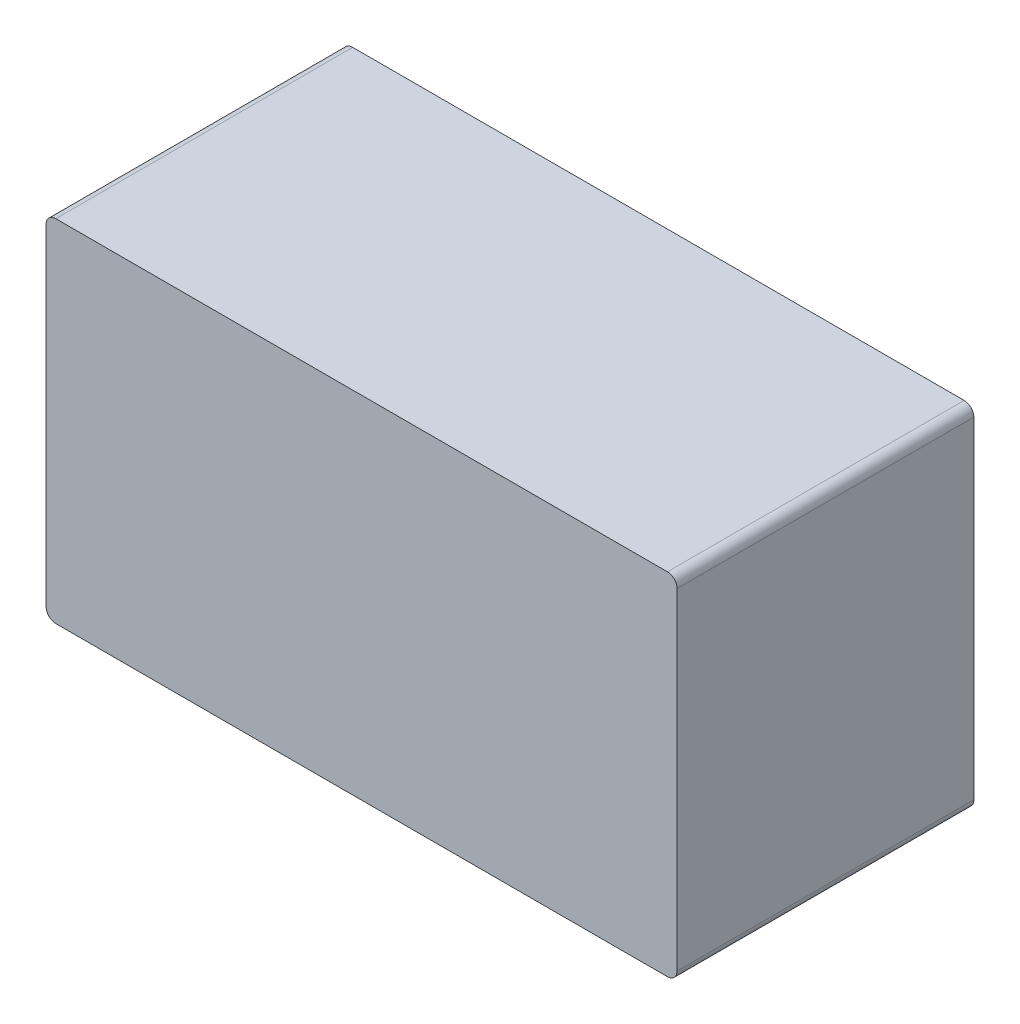
ISO-10303-21;
HEADER;
FILE_DESCRIPTION(('STEP AP214'),'2;1');
FILE_NAME('part.step','',(''),(''),'','','');
FILE_SCHEMA(('AUTOMOTIVE_DESIGN { 1 0 10303 214 1 1 1 1 }'));
ENDSEC;
DATA;
#1=APPLICATION_CONTEXT('core data for automotive mechanical design processes');
#2=APPLICATION_PROTOCOL_DEFINITION('international standard','automotive_design',2000,#1);
#3=PRODUCT_CONTEXT('',#1,'mechanical');
#4=PRODUCT('Part','Part','',(#3));
#5=PRODUCT_RELATED_PRODUCT_CATEGORY('part','',(#4));
#6=PRODUCT_DEFINITION_FORMATION('','',#4);
#7=PRODUCT_DEFINITION_CONTEXT('part definition',#1,'design');
#8=PRODUCT_DEFINITION('design','',#6,#7);
#9=PRODUCT_DEFINITION_SHAPE('','',#8);
#10=(LENGTH_UNIT() NAMED_UNIT(*) SI_UNIT(.MILLI.,.METRE.));
#11=(NAMED_UNIT(*) PLANE_ANGLE_UNIT() SI_UNIT($,.RADIAN.));
#12=(NAMED_UNIT(*) SI_UNIT($,.STERADIAN.) SOLID_ANGLE_UNIT());
#13=UNCERTAINTY_MEASURE_WITH_UNIT(LENGTH_MEASURE(1.E-05),#10,'distance_accuracy_value','');
#14=(GEOMETRIC_REPRESENTATION_CONTEXT(3) GLOBAL_UNCERTAINTY_ASSIGNED_CONTEXT((#13)) GLOBAL_UNIT_ASSIGNED_CONTEXT((#10,
#11,#12)) REPRESENTATION_CONTEXT('',''));
#15=CARTESIAN_POINT('',(0.,0.,0.));
#16=DIRECTION('',(0.,0.,1.));
#17=DIRECTION('',(1.,0.,0.));
#18=AXIS2_PLACEMENT_3D('',#15,#16,#17);
#19=CARTESIAN_POINT('',(38.5,-2.75,-2.5));
#20=DIRECTION('',(0.,0.,1.));
#21=DIRECTION('',(1.,0.,0.));
#22=AXIS2_PLACEMENT_3D('',#19,#20,#21);
#23=PLANE('',#22);
#24=CARTESIAN_POINT('',(38.5,-2.75,-2.5));
#25=DIRECTION('',(0.,0.,1.));
#26=DIRECTION('',(1.,0.,0.));
#27=AXIS2_PLACEMENT_3D('',#24,#25,#26);
#28=CIRCLE('',#27,0.5);
#29=CARTESIAN_POINT('',(39.,-2.75,-2.5));
#30=VERTEX_POINT('',#29);
#31=EDGE_CURVE('E24',#30,#30,#28,.T.);
#32=ORIENTED_EDGE('',*,*,#31,.F.);
#33=EDGE_LOOP('',(#32));
#34=FACE_BOUND('',#33,.T.);
#35=ADVANCED_FACE('F15',(#34),#23,.F.);
#36=CARTESIAN_POINT('',(0.,0.,-2.5));
#37=DIRECTION('',(0.,0.,1.));
#38=DIRECTION('',(1.,0.,0.));
#39=AXIS2_PLACEMENT_3D('',#36,#37,#38);
#40=PLANE('',#39);
#41=CARTESIAN_POINT('',(0.,0.,-2.5));
#42=DIRECTION('',(0.,0.,1.));
#43=DIRECTION('',(1.,0.,0.));
#44=AXIS2_PLACEMENT_3D('',#41,#42,#43);
#45=CIRCLE('',#44,0.5);
#46=CARTESIAN_POINT('',(0.5,0.,-2.5));
#47=VERTEX_POINT('',#46);
#48=EDGE_CURVE('E211',#47,#47,#45,.T.);
#49=ORIENTED_EDGE('',*,*,#48,.F.);
#50=EDGE_LOOP('',(#49));
#51=FACE_BOUND('',#50,.T.);
#52=ADVANCED_FACE('F17',(#51),#40,.F.);
#53=CARTESIAN_POINT('',(38.5,-10.75,-2.5));
#54=DIRECTION('',(0.,0.,1.));
#55=DIRECTION('',(1.,0.,0.));
#56=AXIS2_PLACEMENT_3D('',#53,#54,#55);
#57=PLANE('',#56);
#58=CARTESIAN_POINT('',(38.5,-10.75,-2.5));
#59=DIRECTION('',(0.,0.,1.));
#60=DIRECTION('',(1.,0.,0.));
#61=AXIS2_PLACEMENT_3D('',#58,#59,#60);
#62=CIRCLE('',#61,0.5);
#63=CARTESIAN_POINT('',(39.,-10.75,-2.5));
#64=VERTEX_POINT('',#63);
#65=EDGE_CURVE('E208',#64,#64,#62,.T.);
#66=ORIENTED_EDGE('',*,*,#65,.F.);
#67=EDGE_LOOP('',(#66));
#68=FACE_BOUND('',#67,.T.);
#69=ADVANCED_FACE('F230',(#68),#57,.F.);
#70=CARTESIAN_POINT('',(0.,-10.75,-2.5));
#71=DIRECTION('',(0.,0.,1.));
#72=DIRECTION('',(1.,0.,0.));
#73=AXIS2_PLACEMENT_3D('',#70,#71,#72);
#74=PLANE('',#73);
#75=CARTESIAN_POINT('',(0.,-10.75,-2.5));
#76=DIRECTION('',(0.,0.,1.));
#77=DIRECTION('',(1.,0.,0.));
#78=AXIS2_PLACEMENT_3D('',#75,#76,#77);
#79=CIRCLE('',#78,0.5);
#80=CARTESIAN_POINT('',(0.5,-10.75,-2.5));
#81=VERTEX_POINT('',#80);
#82=EDGE_CURVE('E201',#81,#81,#79,.T.);
#83=ORIENTED_EDGE('',*,*,#82,.F.);
#84=EDGE_LOOP('',(#83));
#85=FACE_BOUND('',#84,.T.);
#86=ADVANCED_FACE('F253',(#85),#74,.F.);
#87=CARTESIAN_POINT('',(38.5,-2.75,-2.5));
#88=DIRECTION('',(0.,0.,-1.));
#89=DIRECTION('',(1.,0.,0.));
#90=AXIS2_PLACEMENT_3D('',#87,#88,#89);
#91=CYLINDRICAL_SURFACE('',#90,0.5);
#92=ORIENTED_EDGE('',*,*,#31,.T.);
#93=DIRECTION('',(0.,0.,1.));
#94=VECTOR('',#93,1.);
#95=CARTESIAN_POINT('',(39.,-2.75,-2.5));
#96=LINE('',#95,#94);
#97=CARTESIAN_POINT('',(39.,-2.75,0.5));
#98=VERTEX_POINT('',#97);
#99=EDGE_CURVE('E9',#30,#98,#96,.T.);
#100=ORIENTED_EDGE('',*,*,#99,.T.);
#101=CARTESIAN_POINT('',(38.5,-2.75,0.5));
#102=DIRECTION('',(0.,0.,1.));
#103=DIRECTION('',(1.,0.,0.));
#104=AXIS2_PLACEMENT_3D('',#101,#102,#103);
#105=CIRCLE('',#104,0.5);
#106=EDGE_CURVE('E190',#98,#98,#105,.T.);
#107=ORIENTED_EDGE('',*,*,#106,.F.);
#108=ORIENTED_EDGE('',*,*,#99,.F.);
#109=EDGE_LOOP('',(#92,#100,#107,#108));
#110=FACE_BOUND('',#109,.T.);
#111=ADVANCED_FACE('F222',(#110),#91,.T.);
#112=CARTESIAN_POINT('',(0.,0.,-2.5));
#113=DIRECTION('',(0.,0.,-1.));
#114=DIRECTION('',(1.,0.,0.));
#115=AXIS2_PLACEMENT_3D('',#112,#113,#114);
#116=CYLINDRICAL_SURFACE('',#115,0.5);
#117=ORIENTED_EDGE('',*,*,#48,.T.);
#118=DIRECTION('',(0.,0.,1.));
#119=VECTOR('',#118,1.);
#120=CARTESIAN_POINT('',(0.5,0.,-2.5));
#121=LINE('',#120,#119);
#122=CARTESIAN_POINT('',(0.5,0.,0.5));
#123=VERTEX_POINT('',#122);
#124=EDGE_CURVE('E43',#47,#123,#121,.T.);
#125=ORIENTED_EDGE('',*,*,#124,.T.);
#126=CARTESIAN_POINT('',(0.,0.,0.5));
#127=DIRECTION('',(0.,0.,1.));
#128=DIRECTION('',(1.,0.,0.));
#129=AXIS2_PLACEMENT_3D('',#126,#127,#128);
#130=CIRCLE('',#129,0.5);
#131=EDGE_CURVE('E185',#123,#123,#130,.T.);
#132=ORIENTED_EDGE('',*,*,#131,.F.);
#133=ORIENTED_EDGE('',*,*,#124,.F.);
#134=EDGE_LOOP('',(#117,#125,#132,#133));
#135=FACE_BOUND('',#134,.T.);
#136=ADVANCED_FACE('F278',(#135),#116,.T.);
#137=CARTESIAN_POINT('',(38.5,-10.75,-2.5));
#138=DIRECTION('',(0.,0.,-1.));
#139=DIRECTION('',(1.,0.,0.));
#140=AXIS2_PLACEMENT_3D('',#137,#138,#139);
#141=CYLINDRICAL_SURFACE('',#140,0.5);
#142=ORIENTED_EDGE('',*,*,#65,.T.);
#143=DIRECTION('',(0.,0.,1.));
#144=VECTOR('',#143,1.);
#145=CARTESIAN_POINT('',(39.,-10.75,-2.5));
#146=LINE('',#145,#144);
#147=CARTESIAN_POINT('',(39.,-10.75,0.5));
#148=VERTEX_POINT('',#147);
#149=EDGE_CURVE('E215',#64,#148,#146,.T.);
#150=ORIENTED_EDGE('',*,*,#149,.T.);
#151=CARTESIAN_POINT('',(38.5,-10.75,0.5));
#152=DIRECTION('',(0.,0.,1.));
#153=DIRECTION('',(1.,0.,0.));
#154=AXIS2_PLACEMENT_3D('',#151,#152,#153);
#155=CIRCLE('',#154,0.5);
#156=EDGE_CURVE('E181',#148,#148,#155,.T.);
#157=ORIENTED_EDGE('',*,*,#156,.F.);
#158=ORIENTED_EDGE('',*,*,#149,.F.);
#159=EDGE_LOOP('',(#142,#150,#157,#158));
#160=FACE_BOUND('',#159,.T.);
#161=ADVANCED_FACE('F234',(#160),#141,.T.);
#162=CARTESIAN_POINT('',(0.,-10.75,-2.5));
#163=DIRECTION('',(0.,0.,-1.));
#164=DIRECTION('',(1.,0.,0.));
#165=AXIS2_PLACEMENT_3D('',#162,#163,#164);
#166=CYLINDRICAL_SURFACE('',#165,0.5);
#167=ORIENTED_EDGE('',*,*,#82,.T.);
#168=DIRECTION('',(0.,0.,1.));
#169=VECTOR('',#168,1.);
#170=CARTESIAN_POINT('',(0.5,-10.75,-2.5));
#171=LINE('',#170,#169);
#172=CARTESIAN_POINT('',(0.5,-10.75,0.5));
#173=VERTEX_POINT('',#172);
#174=EDGE_CURVE('E205',#81,#173,#171,.T.);
#175=ORIENTED_EDGE('',*,*,#174,.T.);
#176=CARTESIAN_POINT('',(0.,-10.75,0.5));
#177=DIRECTION('',(0.,0.,1.));
#178=DIRECTION('',(1.,0.,0.));
#179=AXIS2_PLACEMENT_3D('',#176,#177,#178);
#180=CIRCLE('',#179,0.5);
#181=EDGE_CURVE('E186',#173,#173,#180,.T.);
#182=ORIENTED_EDGE('',*,*,#181,.F.);
#183=ORIENTED_EDGE('',*,*,#174,.F.);
#184=EDGE_LOOP('',(#167,#175,#182,#183));
#185=FACE_BOUND('',#184,.T.);
#186=ADVANCED_FACE('F271',(#185),#166,.T.);
#187=CARTESIAN_POINT('',(42.1,-14.2,0.5));
#188=DIRECTION('',(1.,0.,0.));
#189=DIRECTION('',(0.,1.,0.));
#190=AXIS2_PLACEMENT_3D('',#187,#188,#189);
#191=PLANE('',#190);
#192=DIRECTION('',(0.,1.,0.));
#193=VECTOR('',#192,1.);
#194=CARTESIAN_POINT('',(42.1,-14.2,22.));
#195=LINE('',#194,#193);
#196=CARTESIAN_POINT('',(42.1,-13.5,22.));
#197=VERTEX_POINT('',#196);
#198=CARTESIAN_POINT('',(42.1,10.5,22.));
#199=VERTEX_POINT('',#198);
#200=EDGE_CURVE('E304',#197,#199,#195,.T.);
#201=ORIENTED_EDGE('',*,*,#200,.F.);
#202=DIRECTION('',(0.,0.,1.));
#203=VECTOR('',#202,1.);
#204=CARTESIAN_POINT('',(42.1,-13.5,0.5));
#205=LINE('',#204,#203);
#206=CARTESIAN_POINT('',(42.1,-13.5,0.5));
#207=VERTEX_POINT('',#206);
#208=EDGE_CURVE('E197',#207,#197,#205,.T.);
#209=ORIENTED_EDGE('',*,*,#208,.F.);
#210=DIRECTION('',(0.,1.,0.));
#211=VECTOR('',#210,1.);
#212=CARTESIAN_POINT('',(42.1,-14.2,0.5));
#213=LINE('',#212,#211);
#214=CARTESIAN_POINT('',(42.1,10.5,0.5));
#215=VERTEX_POINT('',#214);
#216=EDGE_CURVE('E172',#207,#215,#213,.T.);
#217=ORIENTED_EDGE('',*,*,#216,.T.);
#218=DIRECTION('',(0.,0.,1.));
#219=VECTOR('',#218,1.);
#220=CARTESIAN_POINT('',(42.1,10.5,0.5));
#221=LINE('',#220,#219);
#222=EDGE_CURVE('E200',#215,#199,#221,.T.);
#223=ORIENTED_EDGE('',*,*,#222,.T.);
#224=EDGE_LOOP('',(#201,#209,#217,#223));
#225=FACE_BOUND('',#224,.T.);
#226=ADVANCED_FACE('F267',(#225),#191,.T.);
#227=CARTESIAN_POINT('',(41.4,10.5,0.5));
#228=DIRECTION('',(0.,0.,1.));
#229=DIRECTION('',(1.,0.,0.));
#230=AXIS2_PLACEMENT_3D('',#227,#228,#229);
#231=CYLINDRICAL_SURFACE('',#230,0.7);
#232=CARTESIAN_POINT('',(41.4,10.5,0.5));
#233=DIRECTION('',(0.,0.,1.));
#234=DIRECTION('',(0.,-1.,0.));
#235=AXIS2_PLACEMENT_3D('',#232,#233,#234);
#236=CIRCLE('',#235,0.7);
#237=CARTESIAN_POINT('',(41.4,11.2,0.5));
#238=VERTEX_POINT('',#237);
#239=EDGE_CURVE('E144',#215,#238,#236,.T.);
#240=ORIENTED_EDGE('',*,*,#239,.T.);
#241=DIRECTION('',(0.,0.,1.));
#242=VECTOR('',#241,1.);
#243=CARTESIAN_POINT('',(41.4,11.2,0.5));
#244=LINE('',#243,#242);
#245=CARTESIAN_POINT('',(41.4,11.2,22.));
#246=VERTEX_POINT('',#245);
#247=EDGE_CURVE('E139',#238,#246,#244,.T.);
#248=ORIENTED_EDGE('',*,*,#247,.T.);
#249=CARTESIAN_POINT('',(41.4,10.5,22.));
#250=DIRECTION('',(0.,0.,1.));
#251=DIRECTION('',(0.,-1.,0.));
#252=AXIS2_PLACEMENT_3D('',#249,#250,#251);
#253=CIRCLE('',#252,0.7);
#254=EDGE_CURVE('E308',#199,#246,#253,.T.);
#255=ORIENTED_EDGE('',*,*,#254,.F.);
#256=ORIENTED_EDGE('',*,*,#222,.F.);
#257=EDGE_LOOP('',(#240,#248,#255,#256));
#258=FACE_BOUND('',#257,.T.);
#259=ADVANCED_FACE('F263',(#258),#231,.T.);
#260=CARTESIAN_POINT('',(41.4,-13.5,0.5));
#261=DIRECTION('',(0.,0.,1.));
#262=DIRECTION('',(1.,0.,0.));
#263=AXIS2_PLACEMENT_3D('',#260,#261,#262);
#264=CYLINDRICAL_SURFACE('',#263,0.7);
#265=ORIENTED_EDGE('',*,*,#208,.T.);
#266=CARTESIAN_POINT('',(41.4,-13.5,22.));
#267=DIRECTION('',(0.,0.,-1.));
#268=DIRECTION('',(0.,-1.,0.));
#269=AXIS2_PLACEMENT_3D('',#266,#267,#268);
#270=CIRCLE('',#269,0.7);
#271=CARTESIAN_POINT('',(41.4,-14.2,22.));
#272=VERTEX_POINT('',#271);
#273=EDGE_CURVE('E303',#197,#272,#270,.T.);
#274=ORIENTED_EDGE('',*,*,#273,.T.);
#275=DIRECTION('',(0.,0.,1.));
#276=VECTOR('',#275,1.);
#277=CARTESIAN_POINT('',(41.4,-14.2,0.5));
#278=LINE('',#277,#276);
#279=CARTESIAN_POINT('',(41.4,-14.2,0.5));
#280=VERTEX_POINT('',#279);
#281=EDGE_CURVE('E194',#280,#272,#278,.T.);
#282=ORIENTED_EDGE('',*,*,#281,.F.);
#283=CARTESIAN_POINT('',(41.4,-13.5,0.5));
#284=DIRECTION('',(0.,0.,-1.));
#285=DIRECTION('',(0.,-1.,0.));
#286=AXIS2_PLACEMENT_3D('',#283,#284,#285);
#287=CIRCLE('',#286,0.7);
#288=EDGE_CURVE('E176',#207,#280,#287,.T.);
#289=ORIENTED_EDGE('',*,*,#288,.F.);
#290=EDGE_LOOP('',(#265,#274,#282,#289));
#291=FACE_BOUND('',#290,.T.);
#292=ADVANCED_FACE('F260',(#291),#264,.T.);
#293=CARTESIAN_POINT('',(-3.6,11.2,0.5));
#294=DIRECTION('',(0.,1.,0.));
#295=DIRECTION('',(1.,0.,0.));
#296=AXIS2_PLACEMENT_3D('',#293,#294,#295);
#297=PLANE('',#296);
#298=DIRECTION('',(1.,0.,0.));
#299=VECTOR('',#298,1.);
#300=CARTESIAN_POINT('',(-3.6,11.2,0.5));
#301=LINE('',#300,#299);
#302=CARTESIAN_POINT('',(-2.9,11.2,0.5));
#303=VERTEX_POINT('',#302);
#304=EDGE_CURVE('E132',#303,#238,#301,.T.);
#305=ORIENTED_EDGE('',*,*,#304,.F.);
#306=DIRECTION('',(0.,0.,1.));
#307=VECTOR('',#306,1.);
#308=CARTESIAN_POINT('',(-2.9,11.2,0.5));
#309=LINE('',#308,#307);
#310=CARTESIAN_POINT('',(-2.9,11.2,22.));
#311=VERTEX_POINT('',#310);
#312=EDGE_CURVE('E137',#303,#311,#309,.T.);
#313=ORIENTED_EDGE('',*,*,#312,.T.);
#314=DIRECTION('',(1.,0.,0.));
#315=VECTOR('',#314,1.);
#316=CARTESIAN_POINT('',(-3.6,11.2,22.));
#317=LINE('',#316,#315);
#318=EDGE_CURVE('E312',#311,#246,#317,.T.);
#319=ORIENTED_EDGE('',*,*,#318,.T.);
#320=ORIENTED_EDGE('',*,*,#247,.F.);
#321=EDGE_LOOP('',(#305,#313,#319,#320));
#322=FACE_BOUND('',#321,.T.);
#323=ADVANCED_FACE('F134',(#322),#297,.T.);
#324=CARTESIAN_POINT('',(-3.6,-14.2,0.5));
#325=DIRECTION('',(0.,1.,0.));
#326=DIRECTION('',(1.,0.,0.));
#327=AXIS2_PLACEMENT_3D('',#324,#325,#326);
#328=PLANE('',#327);
#329=ORIENTED_EDGE('',*,*,#281,.T.);
#330=DIRECTION('',(1.,0.,0.));
#331=VECTOR('',#330,1.);
#332=CARTESIAN_POINT('',(-3.6,-14.2,22.));
#333=LINE('',#332,#331);
#334=CARTESIAN_POINT('',(-2.9,-14.2,22.));
#335=VERTEX_POINT('',#334);
#336=EDGE_CURVE('E300',#335,#272,#333,.T.);
#337=ORIENTED_EDGE('',*,*,#336,.F.);
#338=DIRECTION('',(0.,0.,1.));
#339=VECTOR('',#338,1.);
#340=CARTESIAN_POINT('',(-2.9,-14.2,0.5));
#341=LINE('',#340,#339);
#342=CARTESIAN_POINT('',(-2.9,-14.2,0.5));
#343=VERTEX_POINT('',#342);
#344=EDGE_CURVE('E160',#343,#335,#341,.T.);
#345=ORIENTED_EDGE('',*,*,#344,.F.);
#346=DIRECTION('',(1.,0.,0.));
#347=VECTOR('',#346,1.);
#348=CARTESIAN_POINT('',(-3.6,-14.2,0.5));
#349=LINE('',#348,#347);
#350=EDGE_CURVE('E180',#343,#280,#349,.T.);
#351=ORIENTED_EDGE('',*,*,#350,.T.);
#352=EDGE_LOOP('',(#329,#337,#345,#351));
#353=FACE_BOUND('',#352,.T.);
#354=ADVANCED_FACE('F244',(#353),#328,.F.);
#355=CARTESIAN_POINT('',(-3.6,-14.2,0.5));
#356=DIRECTION('',(0.,0.,1.));
#357=DIRECTION('',(1.,0.,0.));
#358=AXIS2_PLACEMENT_3D('',#355,#356,#357);
#359=PLANE('',#358);
#360=ORIENTED_EDGE('',*,*,#106,.T.);
#361=EDGE_LOOP('',(#360));
#362=FACE_BOUND('',#361,.T.);
#363=ORIENTED_EDGE('',*,*,#131,.T.);
#364=EDGE_LOOP('',(#363));
#365=FACE_BOUND('',#364,.T.);
#366=ORIENTED_EDGE('',*,*,#156,.T.);
#367=EDGE_LOOP('',(#366));
#368=FACE_BOUND('',#367,.T.);
#369=ORIENTED_EDGE('',*,*,#181,.T.);
#370=EDGE_LOOP('',(#369));
#371=FACE_BOUND('',#370,.T.);
#372=CARTESIAN_POINT('',(-2.9,10.5,0.5));
#373=DIRECTION('',(0.,0.,-1.));
#374=DIRECTION('',(0.,-1.,0.));
#375=AXIS2_PLACEMENT_3D('',#372,#373,#374);
#376=CIRCLE('',#375,0.7);
#377=CARTESIAN_POINT('',(-3.6,10.5,0.5));
#378=VERTEX_POINT('',#377);
#379=EDGE_CURVE('E145',#378,#303,#376,.T.);
#380=ORIENTED_EDGE('',*,*,#379,.T.);
#381=ORIENTED_EDGE('',*,*,#304,.T.);
#382=ORIENTED_EDGE('',*,*,#239,.F.);
#383=ORIENTED_EDGE('',*,*,#216,.F.);
#384=ORIENTED_EDGE('',*,*,#288,.T.);
#385=ORIENTED_EDGE('',*,*,#350,.F.);
#386=CARTESIAN_POINT('',(-2.9,-13.5,0.5));
#387=DIRECTION('',(0.,0.,1.));
#388=DIRECTION('',(0.,-1.,0.));
#389=AXIS2_PLACEMENT_3D('',#386,#387,#388);
#390=CIRCLE('',#389,0.7);
#391=CARTESIAN_POINT('',(-3.6,-13.5,0.5));
#392=VERTEX_POINT('',#391);
#393=EDGE_CURVE('E165',#392,#343,#390,.T.);
#394=ORIENTED_EDGE('',*,*,#393,.F.);
#395=DIRECTION('',(0.,1.,0.));
#396=VECTOR('',#395,1.);
#397=CARTESIAN_POINT('',(-3.6,-14.2,0.5));
#398=LINE('',#397,#396);
#399=EDGE_CURVE('E150',#392,#378,#398,.T.);
#400=ORIENTED_EDGE('',*,*,#399,.T.);
#401=EDGE_LOOP('',(#380,#381,#382,#383,#384,#385,#394,#400));
#402=FACE_BOUND('',#401,.T.);
#403=ADVANCED_FACE('F148',(#362,#365,#368,#371,#402),#359,.F.);
#404=CARTESIAN_POINT('',(-2.9,10.5,0.5));
#405=DIRECTION('',(0.,0.,1.));
#406=DIRECTION('',(-1.,0.,0.));
#407=AXIS2_PLACEMENT_3D('',#404,#405,#406);
#408=CYLINDRICAL_SURFACE('',#407,0.7);
#409=DIRECTION('',(0.,0.,1.));
#410=VECTOR('',#409,1.);
#411=CARTESIAN_POINT('',(-3.6,10.5,0.5));
#412=LINE('',#411,#410);
#413=CARTESIAN_POINT('',(-3.6,10.5,22.));
#414=VERTEX_POINT('',#413);
#415=EDGE_CURVE('E339',#378,#414,#412,.T.);
#416=ORIENTED_EDGE('',*,*,#415,.T.);
#417=CARTESIAN_POINT('',(-2.9,10.5,22.));
#418=DIRECTION('',(0.,0.,-1.));
#419=DIRECTION('',(0.,-1.,0.));
#420=AXIS2_PLACEMENT_3D('',#417,#418,#419);
#421=CIRCLE('',#420,0.7);
#422=EDGE_CURVE('E157',#414,#311,#421,.T.);
#423=ORIENTED_EDGE('',*,*,#422,.T.);
#424=ORIENTED_EDGE('',*,*,#312,.F.);
#425=ORIENTED_EDGE('',*,*,#379,.F.);
#426=EDGE_LOOP('',(#416,#423,#424,#425));
#427=FACE_BOUND('',#426,.T.);
#428=ADVANCED_FACE('F156',(#427),#408,.T.);
#429=CARTESIAN_POINT('',(-2.9,-13.5,0.5));
#430=DIRECTION('',(0.,0.,1.));
#431=DIRECTION('',(-1.,0.,0.));
#432=AXIS2_PLACEMENT_3D('',#429,#430,#431);
#433=CYLINDRICAL_SURFACE('',#432,0.7);
#434=ORIENTED_EDGE('',*,*,#393,.T.);
#435=ORIENTED_EDGE('',*,*,#344,.T.);
#436=CARTESIAN_POINT('',(-2.9,-13.5,22.));
#437=DIRECTION('',(0.,0.,1.));
#438=DIRECTION('',(0.,-1.,0.));
#439=AXIS2_PLACEMENT_3D('',#436,#437,#438);
#440=CIRCLE('',#439,0.7);
#441=CARTESIAN_POINT('',(-3.6,-13.5,22.));
#442=VERTEX_POINT('',#441);
#443=EDGE_CURVE('E298',#442,#335,#440,.T.);
#444=ORIENTED_EDGE('',*,*,#443,.F.);
#445=DIRECTION('',(0.,0.,1.));
#446=VECTOR('',#445,1.);
#447=CARTESIAN_POINT('',(-3.6,-13.5,0.5));
#448=LINE('',#447,#446);
#449=EDGE_CURVE('E321',#392,#442,#448,.T.);
#450=ORIENTED_EDGE('',*,*,#449,.F.);
#451=EDGE_LOOP('',(#434,#435,#444,#450));
#452=FACE_BOUND('',#451,.T.);
#453=ADVANCED_FACE('F240',(#452),#433,.T.);
#454=CARTESIAN_POINT('',(-3.6,-14.2,22.));
#455=DIRECTION('',(0.,0.,1.));
#456=DIRECTION('',(1.,0.,0.));
#457=AXIS2_PLACEMENT_3D('',#454,#455,#456);
#458=PLANE('',#457);
#459=DIRECTION('',(0.,1.,0.));
#460=VECTOR('',#459,1.);
#461=CARTESIAN_POINT('',(-3.6,-14.2,22.));
#462=LINE('',#461,#460);
#463=EDGE_CURVE('E329',#442,#414,#462,.T.);
#464=ORIENTED_EDGE('',*,*,#463,.F.);
#465=ORIENTED_EDGE('',*,*,#443,.T.);
#466=ORIENTED_EDGE('',*,*,#336,.T.);
#467=ORIENTED_EDGE('',*,*,#273,.F.);
#468=ORIENTED_EDGE('',*,*,#200,.T.);
#469=ORIENTED_EDGE('',*,*,#254,.T.);
#470=ORIENTED_EDGE('',*,*,#318,.F.);
#471=ORIENTED_EDGE('',*,*,#422,.F.);
#472=EDGE_LOOP('',(#464,#465,#466,#467,#468,#469,#470,#471));
#473=FACE_BOUND('',#472,.T.);
#474=ADVANCED_FACE('F236',(#473),#458,.T.);
#475=CARTESIAN_POINT('',(-3.6,-14.2,0.5));
#476=DIRECTION('',(1.,0.,0.));
#477=DIRECTION('',(0.,1.,0.));
#478=AXIS2_PLACEMENT_3D('',#475,#476,#477);
#479=PLANE('',#478);
#480=ORIENTED_EDGE('',*,*,#415,.F.);
#481=ORIENTED_EDGE('',*,*,#399,.F.);
#482=ORIENTED_EDGE('',*,*,#449,.T.);
#483=ORIENTED_EDGE('',*,*,#463,.T.);
#484=EDGE_LOOP('',(#480,#481,#482,#483));
#485=FACE_BOUND('',#484,.T.);
#486=ADVANCED_FACE('F239',(#485),#479,.F.);
#487=CLOSED_SHELL('',(#35,#52,#69,#86,#111,#136,#161,#186,#226,#259,#292,#323,#354,#403,#428,
#453,#474,#486));
#488=MANIFOLD_SOLID_BREP('B1',#487);
#489=ADVANCED_BREP_SHAPE_REPRESENTATION('',(#18,#488),#14);
#490=SHAPE_DEFINITION_REPRESENTATION(#9,#489);
ENDSEC;
END-ISO-10303-21;
